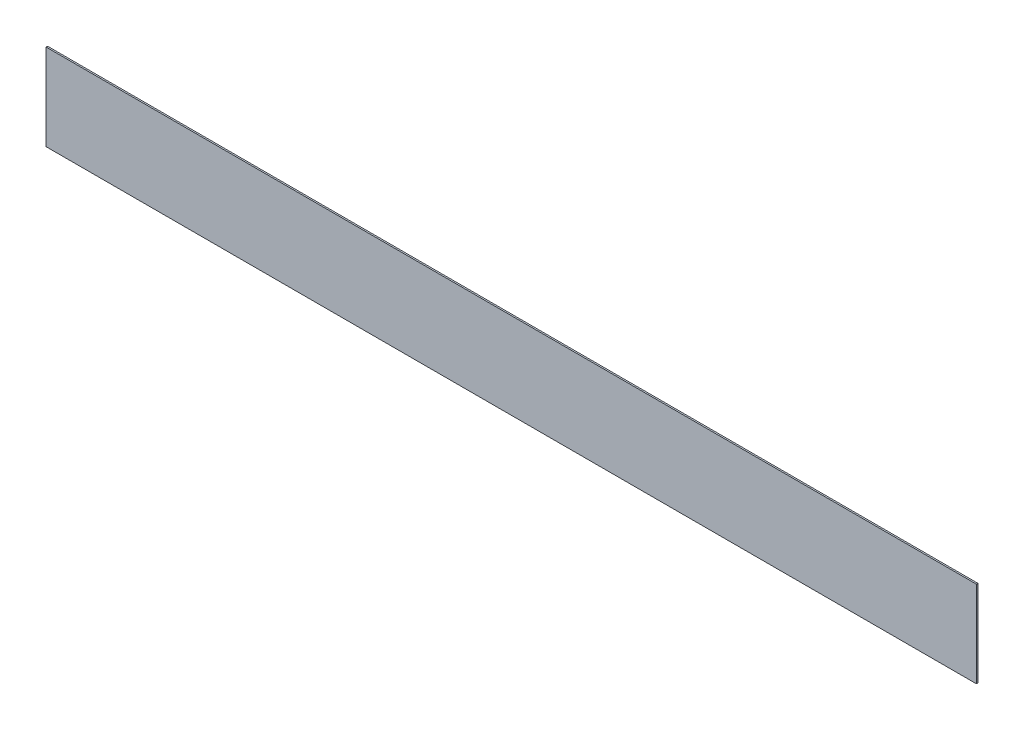
ISO-10303-21;
HEADER;
FILE_DESCRIPTION(('STEP AP214'),'2;1');
FILE_NAME('part.step','',(''),(''),'','','');
FILE_SCHEMA(('AUTOMOTIVE_DESIGN { 1 0 10303 214 1 1 1 1 }'));
ENDSEC;
DATA;
#1=APPLICATION_CONTEXT('core data for automotive mechanical design processes');
#2=APPLICATION_PROTOCOL_DEFINITION('international standard','automotive_design',2000,#1);
#3=PRODUCT_CONTEXT('',#1,'mechanical');
#4=PRODUCT('Part','Part','',(#3));
#5=PRODUCT_RELATED_PRODUCT_CATEGORY('part','',(#4));
#6=PRODUCT_DEFINITION_FORMATION('','',#4);
#7=PRODUCT_DEFINITION_CONTEXT('part definition',#1,'design');
#8=PRODUCT_DEFINITION('design','',#6,#7);
#9=PRODUCT_DEFINITION_SHAPE('','',#8);
#10=(LENGTH_UNIT() NAMED_UNIT(*) SI_UNIT(.MILLI.,.METRE.));
#11=(NAMED_UNIT(*) PLANE_ANGLE_UNIT() SI_UNIT($,.RADIAN.));
#12=(NAMED_UNIT(*) SI_UNIT($,.STERADIAN.) SOLID_ANGLE_UNIT());
#13=UNCERTAINTY_MEASURE_WITH_UNIT(LENGTH_MEASURE(1.E-05),#10,'distance_accuracy_value','');
#14=(GEOMETRIC_REPRESENTATION_CONTEXT(3) GLOBAL_UNCERTAINTY_ASSIGNED_CONTEXT((#13)) GLOBAL_UNIT_ASSIGNED_CONTEXT((#10,
#11,#12)) REPRESENTATION_CONTEXT('',''));
#15=CARTESIAN_POINT('',(0.,0.,0.));
#16=DIRECTION('',(0.,0.,1.));
#17=DIRECTION('',(1.,0.,0.));
#18=AXIS2_PLACEMENT_3D('',#15,#16,#17);
#19=CARTESIAN_POINT('',(1240.,115.,2.));
#20=DIRECTION('',(0.,-1.,0.));
#21=DIRECTION('',(1.,0.,0.));
#22=AXIS2_PLACEMENT_3D('',#19,#20,#21);
#23=PLANE('',#22);
#24=DIRECTION('',(-1.,0.,0.));
#25=VECTOR('',#24,1.);
#26=CARTESIAN_POINT('',(1240.,115.,0.));
#27=LINE('',#26,#25);
#28=CARTESIAN_POINT('',(1240.,115.,0.));
#29=VERTEX_POINT('',#28);
#30=CARTESIAN_POINT('',(0.,115.,0.));
#31=VERTEX_POINT('',#30);
#32=EDGE_CURVE('E107',#29,#31,#27,.T.);
#33=ORIENTED_EDGE('',*,*,#32,.T.);
#34=DIRECTION('',(0.,0.,-1.));
#35=VECTOR('',#34,1.);
#36=CARTESIAN_POINT('',(0.,115.,2.));
#37=LINE('',#36,#35);
#38=CARTESIAN_POINT('',(0.,115.,2.));
#39=VERTEX_POINT('',#38);
#40=EDGE_CURVE('E11',#39,#31,#37,.T.);
#41=ORIENTED_EDGE('',*,*,#40,.F.);
#42=DIRECTION('',(-1.,0.,0.));
#43=VECTOR('',#42,1.);
#44=CARTESIAN_POINT('',(1240.,115.,2.));
#45=LINE('',#44,#43);
#46=CARTESIAN_POINT('',(1240.,115.,2.));
#47=VERTEX_POINT('',#46);
#48=EDGE_CURVE('E91',#47,#39,#45,.T.);
#49=ORIENTED_EDGE('',*,*,#48,.F.);
#50=DIRECTION('',(0.,0.,-1.));
#51=VECTOR('',#50,1.);
#52=CARTESIAN_POINT('',(1240.,115.,2.));
#53=LINE('',#52,#51);
#54=EDGE_CURVE('E103',#47,#29,#53,.T.);
#55=ORIENTED_EDGE('',*,*,#54,.T.);
#56=EDGE_LOOP('',(#33,#41,#49,#55));
#57=FACE_BOUND('',#56,.T.);
#58=ADVANCED_FACE('F39',(#57),#23,.F.);
#59=CARTESIAN_POINT('',(0.,115.,2.));
#60=DIRECTION('',(1.,0.,0.));
#61=DIRECTION('',(0.,1.,0.));
#62=AXIS2_PLACEMENT_3D('',#59,#60,#61);
#63=PLANE('',#62);
#64=DIRECTION('',(0.,-1.,0.));
#65=VECTOR('',#64,1.);
#66=CARTESIAN_POINT('',(0.,115.,0.));
#67=LINE('',#66,#65);
#68=CARTESIAN_POINT('',(0.,0.,0.));
#69=VERTEX_POINT('',#68);
#70=EDGE_CURVE('E96',#31,#69,#67,.T.);
#71=ORIENTED_EDGE('',*,*,#70,.T.);
#72=DIRECTION('',(0.,0.,-1.));
#73=VECTOR('',#72,1.);
#74=CARTESIAN_POINT('',(0.,0.,2.));
#75=LINE('',#74,#73);
#76=CARTESIAN_POINT('',(0.,0.,2.));
#77=VERTEX_POINT('',#76);
#78=EDGE_CURVE('E48',#77,#69,#75,.T.);
#79=ORIENTED_EDGE('',*,*,#78,.F.);
#80=DIRECTION('',(0.,-1.,0.));
#81=VECTOR('',#80,1.);
#82=CARTESIAN_POINT('',(0.,115.,2.));
#83=LINE('',#82,#81);
#84=EDGE_CURVE('E86',#39,#77,#83,.T.);
#85=ORIENTED_EDGE('',*,*,#84,.F.);
#86=ORIENTED_EDGE('',*,*,#40,.T.);
#87=EDGE_LOOP('',(#71,#79,#85,#86));
#88=FACE_BOUND('',#87,.T.);
#89=ADVANCED_FACE('F95',(#88),#63,.F.);
#90=CARTESIAN_POINT('',(1240.,0.,2.));
#91=DIRECTION('',(0.,1.,0.));
#92=DIRECTION('',(-1.,0.,0.));
#93=AXIS2_PLACEMENT_3D('',#90,#91,#92);
#94=PLANE('',#93);
#95=DIRECTION('',(1.,0.,0.));
#96=VECTOR('',#95,1.);
#97=CARTESIAN_POINT('',(1240.,0.,0.));
#98=LINE('',#97,#96);
#99=CARTESIAN_POINT('',(1240.,0.,0.));
#100=VERTEX_POINT('',#99);
#101=EDGE_CURVE('E73',#69,#100,#98,.T.);
#102=ORIENTED_EDGE('',*,*,#101,.T.);
#103=DIRECTION('',(0.,0.,-1.));
#104=VECTOR('',#103,1.);
#105=CARTESIAN_POINT('',(1240.,0.,2.));
#106=LINE('',#105,#104);
#107=CARTESIAN_POINT('',(1240.,0.,2.));
#108=VERTEX_POINT('',#107);
#109=EDGE_CURVE('E98',#108,#100,#106,.T.);
#110=ORIENTED_EDGE('',*,*,#109,.F.);
#111=DIRECTION('',(1.,0.,0.));
#112=VECTOR('',#111,1.);
#113=CARTESIAN_POINT('',(1240.,0.,2.));
#114=LINE('',#113,#112);
#115=EDGE_CURVE('E89',#77,#108,#114,.T.);
#116=ORIENTED_EDGE('',*,*,#115,.F.);
#117=ORIENTED_EDGE('',*,*,#78,.T.);
#118=EDGE_LOOP('',(#102,#110,#116,#117));
#119=FACE_BOUND('',#118,.T.);
#120=ADVANCED_FACE('F99',(#119),#94,.F.);
#121=CARTESIAN_POINT('',(1240.,115.,2.));
#122=DIRECTION('',(-1.,0.,0.));
#123=DIRECTION('',(0.,0.,1.));
#124=AXIS2_PLACEMENT_3D('',#121,#122,#123);
#125=PLANE('',#124);
#126=DIRECTION('',(0.,1.,0.));
#127=VECTOR('',#126,1.);
#128=CARTESIAN_POINT('',(1240.,115.,0.));
#129=LINE('',#128,#127);
#130=EDGE_CURVE('E79',#100,#29,#129,.T.);
#131=ORIENTED_EDGE('',*,*,#130,.T.);
#132=ORIENTED_EDGE('',*,*,#54,.F.);
#133=DIRECTION('',(0.,1.,0.));
#134=VECTOR('',#133,1.);
#135=CARTESIAN_POINT('',(1240.,115.,2.));
#136=LINE('',#135,#134);
#137=EDGE_CURVE('E56',#108,#47,#136,.T.);
#138=ORIENTED_EDGE('',*,*,#137,.F.);
#139=ORIENTED_EDGE('',*,*,#109,.T.);
#140=EDGE_LOOP('',(#131,#132,#138,#139));
#141=FACE_BOUND('',#140,.T.);
#142=ADVANCED_FACE('F120',(#141),#125,.F.);
#143=CARTESIAN_POINT('',(0.,0.,2.));
#144=DIRECTION('',(0.,0.,1.));
#145=DIRECTION('',(1.,0.,0.));
#146=AXIS2_PLACEMENT_3D('',#143,#144,#145);
#147=PLANE('',#146);
#148=ORIENTED_EDGE('',*,*,#48,.T.);
#149=ORIENTED_EDGE('',*,*,#84,.T.);
#150=ORIENTED_EDGE('',*,*,#115,.T.);
#151=ORIENTED_EDGE('',*,*,#137,.T.);
#152=EDGE_LOOP('',(#148,#149,#150,#151));
#153=FACE_BOUND('',#152,.T.);
#154=ADVANCED_FACE('F87',(#153),#147,.T.);
#155=CARTESIAN_POINT('',(0.,0.,0.));
#156=DIRECTION('',(0.,0.,1.));
#157=DIRECTION('',(1.,0.,0.));
#158=AXIS2_PLACEMENT_3D('',#155,#156,#157);
#159=PLANE('',#158);
#160=ORIENTED_EDGE('',*,*,#32,.F.);
#161=ORIENTED_EDGE('',*,*,#130,.F.);
#162=ORIENTED_EDGE('',*,*,#101,.F.);
#163=ORIENTED_EDGE('',*,*,#70,.F.);
#164=EDGE_LOOP('',(#160,#161,#162,#163));
#165=FACE_BOUND('',#164,.T.);
#166=ADVANCED_FACE('F123',(#165),#159,.F.);
#167=CLOSED_SHELL('',(#58,#89,#120,#142,#154,#166));
#168=MANIFOLD_SOLID_BREP('B2',#167);
#169=ADVANCED_BREP_SHAPE_REPRESENTATION('',(#18,#168),#14);
#170=SHAPE_DEFINITION_REPRESENTATION(#9,#169);
ENDSEC;
END-ISO-10303-21;
